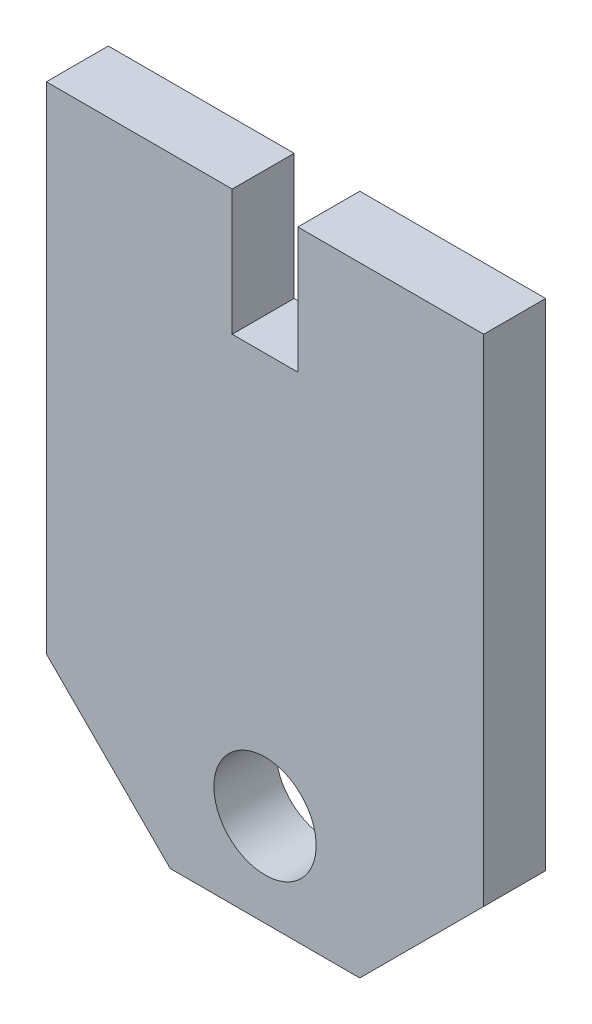
ISO-10303-21;
HEADER;
FILE_DESCRIPTION(('STEP AP214'),'2;1');
FILE_NAME('part.step','',(''),(''),'','','');
FILE_SCHEMA(('AUTOMOTIVE_DESIGN { 1 0 10303 214 1 1 1 1 }'));
ENDSEC;
DATA;
#1=APPLICATION_CONTEXT('core data for automotive mechanical design processes');
#2=APPLICATION_PROTOCOL_DEFINITION('international standard','automotive_design',2000,#1);
#3=PRODUCT_CONTEXT('',#1,'mechanical');
#4=PRODUCT('Part','Part','',(#3));
#5=PRODUCT_RELATED_PRODUCT_CATEGORY('part','',(#4));
#6=PRODUCT_DEFINITION_FORMATION('','',#4);
#7=PRODUCT_DEFINITION_CONTEXT('part definition',#1,'design');
#8=PRODUCT_DEFINITION('design','',#6,#7);
#9=PRODUCT_DEFINITION_SHAPE('','',#8);
#10=(LENGTH_UNIT() NAMED_UNIT(*) SI_UNIT(.MILLI.,.METRE.));
#11=(NAMED_UNIT(*) PLANE_ANGLE_UNIT() SI_UNIT($,.RADIAN.));
#12=(NAMED_UNIT(*) SI_UNIT($,.STERADIAN.) SOLID_ANGLE_UNIT());
#13=UNCERTAINTY_MEASURE_WITH_UNIT(LENGTH_MEASURE(1.E-05),#10,'distance_accuracy_value','');
#14=(GEOMETRIC_REPRESENTATION_CONTEXT(3) GLOBAL_UNCERTAINTY_ASSIGNED_CONTEXT((#13)) GLOBAL_UNIT_ASSIGNED_CONTEXT((#10,
#11,#12)) REPRESENTATION_CONTEXT('',''));
#15=CARTESIAN_POINT('',(0.,0.,0.));
#16=DIRECTION('',(0.,0.,1.));
#17=DIRECTION('',(1.,0.,0.));
#18=AXIS2_PLACEMENT_3D('',#15,#16,#17);
#19=CARTESIAN_POINT('',(267.938131010374,3.70831453379132E-13,-20.0000000000002));
#20=DIRECTION('',(1.,0.,0.));
#21=DIRECTION('',(0.,1.,0.));
#22=AXIS2_PLACEMENT_3D('',#19,#20,#21);
#23=PLANE('',#22);
#24=DIRECTION('',(0.,-1.,0.));
#25=VECTOR('',#24,1.);
#26=CARTESIAN_POINT('',(267.938131010374,3.70831453379132E-13,-30.0000000000002));
#27=LINE('',#26,#25);
#28=CARTESIAN_POINT('',(267.938131010374,-64.700000000005,-30.0000000000002));
#29=VERTEX_POINT('',#28);
#30=CARTESIAN_POINT('',(267.938131010374,-144.700000000005,-30.0000000000002));
#31=VERTEX_POINT('',#30);
#32=EDGE_CURVE('E182',#29,#31,#27,.T.);
#33=ORIENTED_EDGE('',*,*,#32,.F.);
#34=DIRECTION('',(0.,0.,-1.));
#35=VECTOR('',#34,1.);
#36=CARTESIAN_POINT('',(267.938131010374,-64.700000000005,-20.0000000000002));
#37=LINE('',#36,#35);
#38=CARTESIAN_POINT('',(267.938131010374,-64.700000000005,-20.0000000000002));
#39=VERTEX_POINT('',#38);
#40=EDGE_CURVE('E12',#39,#29,#37,.T.);
#41=ORIENTED_EDGE('',*,*,#40,.F.);
#42=DIRECTION('',(0.,-1.,0.));
#43=VECTOR('',#42,1.);
#44=CARTESIAN_POINT('',(267.938131010374,3.70831453379132E-13,-20.0000000000002));
#45=LINE('',#44,#43);
#46=CARTESIAN_POINT('',(267.938131010374,-144.700000000005,-20.0000000000002));
#47=VERTEX_POINT('',#46);
#48=EDGE_CURVE('E173',#39,#47,#45,.T.);
#49=ORIENTED_EDGE('',*,*,#48,.T.);
#50=DIRECTION('',(0.,0.,-1.));
#51=VECTOR('',#50,1.);
#52=CARTESIAN_POINT('',(267.938131010374,-144.700000000005,-20.0000000000002));
#53=LINE('',#52,#51);
#54=EDGE_CURVE('E45',#47,#31,#53,.T.);
#55=ORIENTED_EDGE('',*,*,#54,.T.);
#56=EDGE_LOOP('',(#33,#41,#49,#55));
#57=FACE_BOUND('',#56,.T.);
#58=ADVANCED_FACE('F42',(#57),#23,.T.);
#59=CARTESIAN_POINT('',(-1.03258438428721E-13,-64.700000000005,-19.9999999999991));
#60=DIRECTION('',(0.,1.,0.));
#61=DIRECTION('',(-1.,0.,0.));
#62=AXIS2_PLACEMENT_3D('',#59,#60,#61);
#63=PLANE('',#62);
#64=DIRECTION('',(1.,0.,0.));
#65=VECTOR('',#64,1.);
#66=CARTESIAN_POINT('',(-1.03258438428721E-13,-64.700000000005,-29.9999999999991));
#67=LINE('',#66,#65);
#68=CARTESIAN_POINT('',(237.938131010374,-64.700000000005,-30.0000000000001));
#69=VERTEX_POINT('',#68);
#70=EDGE_CURVE('E202',#69,#29,#67,.T.);
#71=ORIENTED_EDGE('',*,*,#70,.F.);
#72=DIRECTION('',(0.,0.,-1.));
#73=VECTOR('',#72,1.);
#74=CARTESIAN_POINT('',(237.938131010374,-64.700000000005,-20.0000000000001));
#75=LINE('',#74,#73);
#76=CARTESIAN_POINT('',(237.938131010374,-64.700000000005,-20.0000000000001));
#77=VERTEX_POINT('',#76);
#78=EDGE_CURVE('E51',#77,#69,#75,.T.);
#79=ORIENTED_EDGE('',*,*,#78,.F.);
#80=DIRECTION('',(1.,0.,0.));
#81=VECTOR('',#80,1.);
#82=CARTESIAN_POINT('',(-1.03258438428721E-13,-64.700000000005,-19.9999999999991));
#83=LINE('',#82,#81);
#84=EDGE_CURVE('E140',#77,#39,#83,.T.);
#85=ORIENTED_EDGE('',*,*,#84,.T.);
#86=ORIENTED_EDGE('',*,*,#40,.T.);
#87=EDGE_LOOP('',(#71,#79,#85,#86));
#88=FACE_BOUND('',#87,.T.);
#89=ADVANCED_FACE('F227',(#88),#63,.T.);
#90=CARTESIAN_POINT('',(237.938131010374,-6.51658609951015E-13,-20.0000000000001));
#91=DIRECTION('',(-1.,0.,0.));
#92=DIRECTION('',(0.,-1.,0.));
#93=AXIS2_PLACEMENT_3D('',#90,#91,#92);
#94=PLANE('',#93);
#95=DIRECTION('',(0.,1.,0.));
#96=VECTOR('',#95,1.);
#97=CARTESIAN_POINT('',(237.938131010374,-6.51658609951015E-13,-30.0000000000001));
#98=LINE('',#97,#96);
#99=CARTESIAN_POINT('',(237.938131010374,-85.000000000005,-30.0000000000001));
#100=VERTEX_POINT('',#99);
#101=EDGE_CURVE('E128',#100,#69,#98,.T.);
#102=ORIENTED_EDGE('',*,*,#101,.F.);
#103=DIRECTION('',(0.,0.,-1.));
#104=VECTOR('',#103,1.);
#105=CARTESIAN_POINT('',(237.938131010374,-85.000000000005,-20.0000000000001));
#106=LINE('',#105,#104);
#107=CARTESIAN_POINT('',(237.938131010374,-85.000000000005,-20.0000000000001));
#108=VERTEX_POINT('',#107);
#109=EDGE_CURVE('E123',#108,#100,#106,.T.);
#110=ORIENTED_EDGE('',*,*,#109,.F.);
#111=DIRECTION('',(0.,1.,0.));
#112=VECTOR('',#111,1.);
#113=CARTESIAN_POINT('',(237.938131010374,-6.51658609951015E-13,-20.0000000000001));
#114=LINE('',#113,#112);
#115=EDGE_CURVE('E126',#108,#77,#114,.T.);
#116=ORIENTED_EDGE('',*,*,#115,.T.);
#117=ORIENTED_EDGE('',*,*,#78,.T.);
#118=EDGE_LOOP('',(#102,#110,#116,#117));
#119=FACE_BOUND('',#118,.T.);
#120=ADVANCED_FACE('F125',(#119),#94,.T.);
#121=CARTESIAN_POINT('',(-1.03258438428721E-13,-85.000000000005,-19.9999999999991));
#122=DIRECTION('',(0.,1.,0.));
#123=DIRECTION('',(-1.,0.,0.));
#124=AXIS2_PLACEMENT_3D('',#121,#122,#123);
#125=PLANE('',#124);
#126=DIRECTION('',(1.,0.,0.));
#127=VECTOR('',#126,1.);
#128=CARTESIAN_POINT('',(-1.03258438428721E-13,-85.000000000005,-29.9999999999991));
#129=LINE('',#128,#127);
#130=CARTESIAN_POINT('',(227.338131010374,-85.000000000005,-30.0000000000001));
#131=VERTEX_POINT('',#130);
#132=EDGE_CURVE('E199',#131,#100,#129,.T.);
#133=ORIENTED_EDGE('',*,*,#132,.F.);
#134=DIRECTION('',(0.,0.,-1.));
#135=VECTOR('',#134,1.);
#136=CARTESIAN_POINT('',(227.338131010374,-85.000000000005,-20.0000000000001));
#137=LINE('',#136,#135);
#138=CARTESIAN_POINT('',(227.338131010374,-85.000000000005,-20.0000000000001));
#139=VERTEX_POINT('',#138);
#140=EDGE_CURVE('E133',#139,#131,#137,.T.);
#141=ORIENTED_EDGE('',*,*,#140,.F.);
#142=DIRECTION('',(1.,0.,0.));
#143=VECTOR('',#142,1.);
#144=CARTESIAN_POINT('',(-1.03258438428721E-13,-85.000000000005,-19.9999999999991));
#145=LINE('',#144,#143);
#146=EDGE_CURVE('E139',#139,#108,#145,.T.);
#147=ORIENTED_EDGE('',*,*,#146,.T.);
#148=ORIENTED_EDGE('',*,*,#109,.T.);
#149=EDGE_LOOP('',(#133,#141,#147,#148));
#150=FACE_BOUND('',#149,.T.);
#151=ADVANCED_FACE('F142',(#150),#125,.T.);
#152=CARTESIAN_POINT('',(227.338131010374,0.,-20.0000000000001));
#153=DIRECTION('',(-1.,0.,0.));
#154=DIRECTION('',(0.,-1.,0.));
#155=AXIS2_PLACEMENT_3D('',#152,#153,#154);
#156=PLANE('',#155);
#157=DIRECTION('',(0.,1.,0.));
#158=VECTOR('',#157,1.);
#159=CARTESIAN_POINT('',(227.338131010374,0.,-30.0000000000001));
#160=LINE('',#159,#158);
#161=CARTESIAN_POINT('',(227.338131010374,-64.700000000005,-30.0000000000001));
#162=VERTEX_POINT('',#161);
#163=EDGE_CURVE('E197',#131,#162,#160,.T.);
#164=ORIENTED_EDGE('',*,*,#163,.T.);
#165=DIRECTION('',(0.,0.,-1.));
#166=VECTOR('',#165,1.);
#167=CARTESIAN_POINT('',(227.338131010374,-64.700000000005,-20.0000000000001));
#168=LINE('',#167,#166);
#169=CARTESIAN_POINT('',(227.338131010374,-64.700000000005,-20.0000000000001));
#170=VERTEX_POINT('',#169);
#171=EDGE_CURVE('E209',#170,#162,#168,.T.);
#172=ORIENTED_EDGE('',*,*,#171,.F.);
#173=DIRECTION('',(0.,1.,0.));
#174=VECTOR('',#173,1.);
#175=CARTESIAN_POINT('',(227.338131010374,0.,-20.0000000000001));
#176=LINE('',#175,#174);
#177=EDGE_CURVE('E144',#139,#170,#176,.T.);
#178=ORIENTED_EDGE('',*,*,#177,.F.);
#179=ORIENTED_EDGE('',*,*,#140,.T.);
#180=EDGE_LOOP('',(#164,#172,#178,#179));
#181=FACE_BOUND('',#180,.T.);
#182=ADVANCED_FACE('F241',(#181),#156,.F.);
#183=CARTESIAN_POINT('',(0.,-64.7000000000051,-19.9999999999991));
#184=DIRECTION('',(0.,-1.,0.));
#185=DIRECTION('',(1.,0.,0.));
#186=AXIS2_PLACEMENT_3D('',#183,#184,#185);
#187=PLANE('',#186);
#188=DIRECTION('',(-1.,0.,0.));
#189=VECTOR('',#188,1.);
#190=CARTESIAN_POINT('',(0.,-64.7000000000051,-29.9999999999991));
#191=LINE('',#190,#189);
#192=CARTESIAN_POINT('',(197.338131010374,-64.700000000005,-29.9999999999999));
#193=VERTEX_POINT('',#192);
#194=EDGE_CURVE('E195',#162,#193,#191,.T.);
#195=ORIENTED_EDGE('',*,*,#194,.T.);
#196=DIRECTION('',(0.,0.,-1.));
#197=VECTOR('',#196,1.);
#198=CARTESIAN_POINT('',(197.338131010374,-64.700000000005,-19.9999999999999));
#199=LINE('',#198,#197);
#200=CARTESIAN_POINT('',(197.338131010374,-64.700000000005,-19.9999999999999));
#201=VERTEX_POINT('',#200);
#202=EDGE_CURVE('E212',#201,#193,#199,.T.);
#203=ORIENTED_EDGE('',*,*,#202,.F.);
#204=DIRECTION('',(-1.,0.,0.));
#205=VECTOR('',#204,1.);
#206=CARTESIAN_POINT('',(0.,-64.7000000000051,-19.9999999999991));
#207=LINE('',#206,#205);
#208=EDGE_CURVE('E146',#170,#201,#207,.T.);
#209=ORIENTED_EDGE('',*,*,#208,.F.);
#210=ORIENTED_EDGE('',*,*,#171,.T.);
#211=EDGE_LOOP('',(#195,#203,#209,#210));
#212=FACE_BOUND('',#211,.T.);
#213=ADVANCED_FACE('F244',(#212),#187,.F.);
#214=CARTESIAN_POINT('',(197.338131010374,0.,-19.9999999999999));
#215=DIRECTION('',(1.,0.,0.));
#216=DIRECTION('',(0.,1.,0.));
#217=AXIS2_PLACEMENT_3D('',#214,#215,#216);
#218=PLANE('',#217);
#219=DIRECTION('',(0.,-1.,0.));
#220=VECTOR('',#219,1.);
#221=CARTESIAN_POINT('',(197.338131010374,0.,-30.));
#222=LINE('',#221,#220);
#223=CARTESIAN_POINT('',(197.338131010374,-144.700000000005,-29.9999999999999));
#224=VERTEX_POINT('',#223);
#225=EDGE_CURVE('E193',#193,#224,#222,.T.);
#226=ORIENTED_EDGE('',*,*,#225,.T.);
#227=DIRECTION('',(0.,0.,-1.));
#228=VECTOR('',#227,1.);
#229=CARTESIAN_POINT('',(197.338131010374,-144.700000000005,-19.9999999999999));
#230=LINE('',#229,#228);
#231=CARTESIAN_POINT('',(197.338131010374,-144.700000000005,-19.9999999999999));
#232=VERTEX_POINT('',#231);
#233=EDGE_CURVE('E215',#232,#224,#230,.T.);
#234=ORIENTED_EDGE('',*,*,#233,.F.);
#235=DIRECTION('',(0.,-1.,0.));
#236=VECTOR('',#235,1.);
#237=CARTESIAN_POINT('',(197.338131010374,0.,-19.9999999999999));
#238=LINE('',#237,#236);
#239=EDGE_CURVE('E162',#201,#232,#238,.T.);
#240=ORIENTED_EDGE('',*,*,#239,.F.);
#241=ORIENTED_EDGE('',*,*,#202,.T.);
#242=EDGE_LOOP('',(#226,#234,#240,#241));
#243=FACE_BOUND('',#242,.T.);
#244=ADVANCED_FACE('F248',(#243),#218,.F.);
#245=CARTESIAN_POINT('',(26.3190655051848,26.3190655051849,-19.9999999999992));
#246=DIRECTION('',(0.707106781186548,0.707106781186547,0.));
#247=DIRECTION('',(-0.707106781186547,0.707106781186548,0.));
#248=AXIS2_PLACEMENT_3D('',#245,#246,#247);
#249=PLANE('',#248);
#250=DIRECTION('',(0.707106781186547,-0.707106781186548,0.));
#251=VECTOR('',#250,1.);
#252=CARTESIAN_POINT('',(26.3190655051848,26.3190655051849,-29.9999999999992));
#253=LINE('',#252,#251);
#254=CARTESIAN_POINT('',(217.338131010374,-164.700000000005,-30.));
#255=VERTEX_POINT('',#254);
#256=EDGE_CURVE('E191',#224,#255,#253,.T.);
#257=ORIENTED_EDGE('',*,*,#256,.T.);
#258=DIRECTION('',(0.,0.,-1.));
#259=VECTOR('',#258,1.);
#260=CARTESIAN_POINT('',(217.338131010374,-164.700000000005,-20.));
#261=LINE('',#260,#259);
#262=CARTESIAN_POINT('',(217.338131010374,-164.700000000005,-20.));
#263=VERTEX_POINT('',#262);
#264=EDGE_CURVE('E218',#263,#255,#261,.T.);
#265=ORIENTED_EDGE('',*,*,#264,.F.);
#266=DIRECTION('',(0.707106781186547,-0.707106781186548,0.));
#267=VECTOR('',#266,1.);
#268=CARTESIAN_POINT('',(26.3190655051848,26.3190655051849,-19.9999999999992));
#269=LINE('',#268,#267);
#270=EDGE_CURVE('E165',#232,#263,#269,.T.);
#271=ORIENTED_EDGE('',*,*,#270,.F.);
#272=ORIENTED_EDGE('',*,*,#233,.T.);
#273=EDGE_LOOP('',(#257,#265,#271,#272));
#274=FACE_BOUND('',#273,.T.);
#275=ADVANCED_FACE('F252',(#274),#249,.F.);
#276=CARTESIAN_POINT('',(-1.03258438428721E-13,-164.700000000005,-19.9999999999991));
#277=DIRECTION('',(0.,1.,0.));
#278=DIRECTION('',(-1.,0.,0.));
#279=AXIS2_PLACEMENT_3D('',#276,#277,#278);
#280=PLANE('',#279);
#281=DIRECTION('',(1.,0.,0.));
#282=VECTOR('',#281,1.);
#283=CARTESIAN_POINT('',(-1.03258438428721E-13,-164.700000000005,-29.9999999999991));
#284=LINE('',#283,#282);
#285=CARTESIAN_POINT('',(247.938131010374,-164.700000000005,-30.0000000000002));
#286=VERTEX_POINT('',#285);
#287=EDGE_CURVE('E188',#255,#286,#284,.T.);
#288=ORIENTED_EDGE('',*,*,#287,.T.);
#289=DIRECTION('',(0.,0.,-1.));
#290=VECTOR('',#289,1.);
#291=CARTESIAN_POINT('',(247.938131010374,-164.700000000005,-20.0000000000001));
#292=LINE('',#291,#290);
#293=CARTESIAN_POINT('',(247.938131010374,-164.700000000005,-20.0000000000001));
#294=VERTEX_POINT('',#293);
#295=EDGE_CURVE('E220',#294,#286,#292,.T.);
#296=ORIENTED_EDGE('',*,*,#295,.F.);
#297=DIRECTION('',(1.,0.,0.));
#298=VECTOR('',#297,1.);
#299=CARTESIAN_POINT('',(-1.03258438428721E-13,-164.700000000005,-19.9999999999991));
#300=LINE('',#299,#298);
#301=EDGE_CURVE('E168',#263,#294,#300,.T.);
#302=ORIENTED_EDGE('',*,*,#301,.F.);
#303=ORIENTED_EDGE('',*,*,#264,.T.);
#304=EDGE_LOOP('',(#288,#296,#302,#303));
#305=FACE_BOUND('',#304,.T.);
#306=ADVANCED_FACE('F256',(#305),#280,.F.);
#307=CARTESIAN_POINT('',(206.319065505189,-206.31906550519,-20.));
#308=DIRECTION('',(0.707106781186546,-0.70710678118655,0.));
#309=DIRECTION('',(0.70710678118655,0.707106781186546,0.));
#310=AXIS2_PLACEMENT_3D('',#307,#308,#309);
#311=PLANE('',#310);
#312=DIRECTION('',(-0.70710678118655,-0.707106781186546,0.));
#313=VECTOR('',#312,1.);
#314=CARTESIAN_POINT('',(206.319065505189,-206.31906550519,-30.));
#315=LINE('',#314,#313);
#316=EDGE_CURVE('E185',#31,#286,#315,.T.);
#317=ORIENTED_EDGE('',*,*,#316,.F.);
#318=ORIENTED_EDGE('',*,*,#54,.F.);
#319=DIRECTION('',(-0.70710678118655,-0.707106781186546,0.));
#320=VECTOR('',#319,1.);
#321=CARTESIAN_POINT('',(206.319065505189,-206.31906550519,-20.));
#322=LINE('',#321,#320);
#323=EDGE_CURVE('E170',#47,#294,#322,.T.);
#324=ORIENTED_EDGE('',*,*,#323,.T.);
#325=ORIENTED_EDGE('',*,*,#295,.T.);
#326=EDGE_LOOP('',(#317,#318,#324,#325));
#327=FACE_BOUND('',#326,.T.);
#328=ADVANCED_FACE('F222',(#327),#311,.T.);
#329=CARTESIAN_POINT('',(232.638131010374,-149.700000000005,-20.0000000000001));
#330=DIRECTION('',(0.,0.,-1.));
#331=DIRECTION('',(-1.,0.,0.));
#332=AXIS2_PLACEMENT_3D('',#329,#330,#331);
#333=CYLINDRICAL_SURFACE('',#332,8.25);
#334=CARTESIAN_POINT('',(232.638131010374,-149.700000000005,-20.0000000000001));
#335=DIRECTION('',(0.,0.,-1.));
#336=DIRECTION('',(-1.,0.,0.));
#337=AXIS2_PLACEMENT_3D('',#334,#335,#336);
#338=CIRCLE('',#337,8.25);
#339=CARTESIAN_POINT('',(224.388131010374,-149.700000000005,-20.0000000000001));
#340=VERTEX_POINT('',#339);
#341=EDGE_CURVE('E179',#340,#340,#338,.F.);
#342=ORIENTED_EDGE('',*,*,#341,.T.);
#343=EDGE_LOOP('',(#342));
#344=FACE_BOUND('',#343,.T.);
#345=CARTESIAN_POINT('',(232.638131010374,-149.700000000005,-30.0000000000001));
#346=DIRECTION('',(0.,0.,-1.));
#347=DIRECTION('',(-1.,0.,0.));
#348=AXIS2_PLACEMENT_3D('',#345,#346,#347);
#349=CIRCLE('',#348,8.25);
#350=CARTESIAN_POINT('',(224.388131010374,-149.700000000005,-30.0000000000001));
#351=VERTEX_POINT('',#350);
#352=EDGE_CURVE('E175',#351,#351,#349,.F.);
#353=ORIENTED_EDGE('',*,*,#352,.F.);
#354=EDGE_LOOP('',(#353));
#355=FACE_BOUND('',#354,.T.);
#356=ADVANCED_FACE('F236',(#344,#355),#333,.F.);
#357=CARTESIAN_POINT('',(-1.03258438428721E-13,0.,-19.9999999999991));
#358=DIRECTION('',(0.,0.,-1.));
#359=DIRECTION('',(-1.,0.,0.));
#360=AXIS2_PLACEMENT_3D('',#357,#358,#359);
#361=PLANE('',#360);
#362=ORIENTED_EDGE('',*,*,#48,.F.);
#363=ORIENTED_EDGE('',*,*,#84,.F.);
#364=ORIENTED_EDGE('',*,*,#115,.F.);
#365=ORIENTED_EDGE('',*,*,#146,.F.);
#366=ORIENTED_EDGE('',*,*,#177,.T.);
#367=ORIENTED_EDGE('',*,*,#208,.T.);
#368=ORIENTED_EDGE('',*,*,#239,.T.);
#369=ORIENTED_EDGE('',*,*,#270,.T.);
#370=ORIENTED_EDGE('',*,*,#301,.T.);
#371=ORIENTED_EDGE('',*,*,#323,.F.);
#372=EDGE_LOOP('',(#362,#363,#364,#365,#366,#367,#368,#369,#370,#371));
#373=FACE_BOUND('',#372,.T.);
#374=ORIENTED_EDGE('',*,*,#341,.F.);
#375=EDGE_LOOP('',(#374));
#376=FACE_BOUND('',#375,.T.);
#377=ADVANCED_FACE('F137',(#373,#376),#361,.F.);
#378=CARTESIAN_POINT('',(-1.03258438428721E-13,0.,-29.9999999999991));
#379=DIRECTION('',(0.,0.,-1.));
#380=DIRECTION('',(-1.,0.,0.));
#381=AXIS2_PLACEMENT_3D('',#378,#379,#380);
#382=PLANE('',#381);
#383=ORIENTED_EDGE('',*,*,#32,.T.);
#384=ORIENTED_EDGE('',*,*,#316,.T.);
#385=ORIENTED_EDGE('',*,*,#287,.F.);
#386=ORIENTED_EDGE('',*,*,#256,.F.);
#387=ORIENTED_EDGE('',*,*,#225,.F.);
#388=ORIENTED_EDGE('',*,*,#194,.F.);
#389=ORIENTED_EDGE('',*,*,#163,.F.);
#390=ORIENTED_EDGE('',*,*,#132,.T.);
#391=ORIENTED_EDGE('',*,*,#101,.T.);
#392=ORIENTED_EDGE('',*,*,#70,.T.);
#393=EDGE_LOOP('',(#383,#384,#385,#386,#387,#388,#389,#390,#391,#392));
#394=FACE_BOUND('',#393,.T.);
#395=ORIENTED_EDGE('',*,*,#352,.T.);
#396=EDGE_LOOP('',(#395));
#397=FACE_BOUND('',#396,.T.);
#398=ADVANCED_FACE('F225',(#394,#397),#382,.T.);
#399=CLOSED_SHELL('',(#58,#89,#120,#151,#182,#213,#244,#275,#306,#328,#356,#377,#398));
#400=MANIFOLD_SOLID_BREP('B2',#399);
#401=ADVANCED_BREP_SHAPE_REPRESENTATION('',(#18,#400),#14);
#402=SHAPE_DEFINITION_REPRESENTATION(#9,#401);
ENDSEC;
END-ISO-10303-21;
